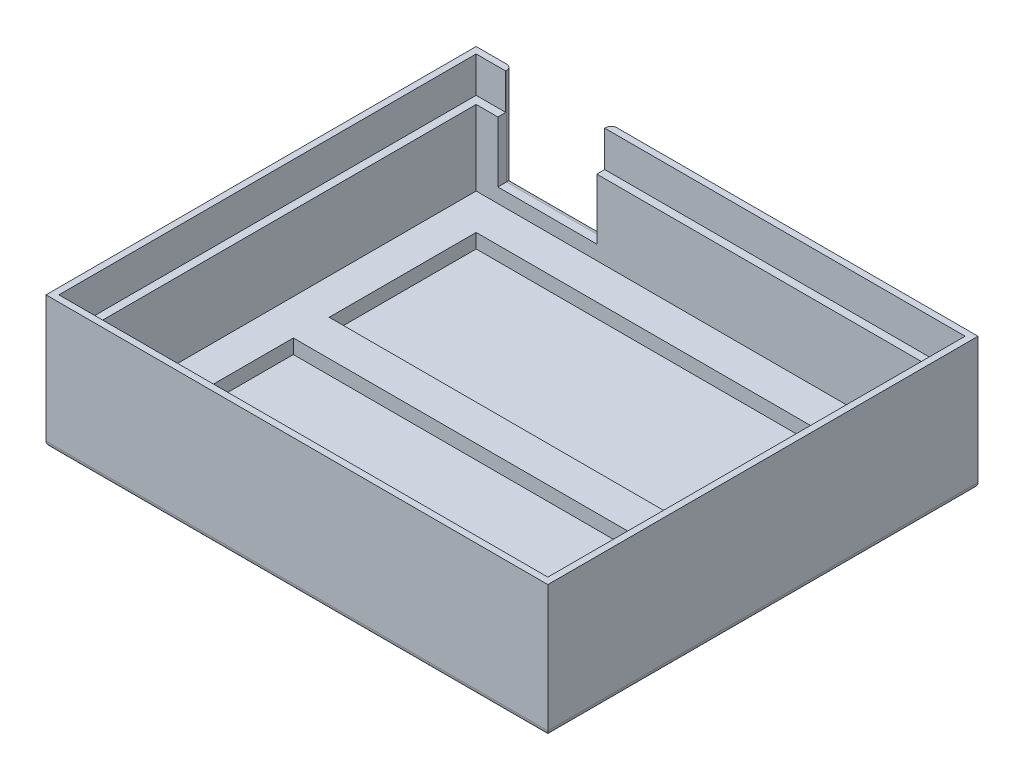
ISO-10303-21;
HEADER;
FILE_DESCRIPTION(('STEP AP214'),'2;1');
FILE_NAME('part.step','',(''),(''),'','','');
FILE_SCHEMA(('AUTOMOTIVE_DESIGN { 1 0 10303 214 1 1 1 1 }'));
ENDSEC;
DATA;
#1=APPLICATION_CONTEXT('core data for automotive mechanical design processes');
#2=APPLICATION_PROTOCOL_DEFINITION('international standard','automotive_design',2000,#1);
#3=PRODUCT_CONTEXT('',#1,'mechanical');
#4=PRODUCT('Part','Part','',(#3));
#5=PRODUCT_RELATED_PRODUCT_CATEGORY('part','',(#4));
#6=PRODUCT_DEFINITION_FORMATION('','',#4);
#7=PRODUCT_DEFINITION_CONTEXT('part definition',#1,'design');
#8=PRODUCT_DEFINITION('design','',#6,#7);
#9=PRODUCT_DEFINITION_SHAPE('','',#8);
#10=(LENGTH_UNIT() NAMED_UNIT(*) SI_UNIT(.MILLI.,.METRE.));
#11=(NAMED_UNIT(*) PLANE_ANGLE_UNIT() SI_UNIT($,.RADIAN.));
#12=(NAMED_UNIT(*) SI_UNIT($,.STERADIAN.) SOLID_ANGLE_UNIT());
#13=UNCERTAINTY_MEASURE_WITH_UNIT(LENGTH_MEASURE(1.E-05),#10,'distance_accuracy_value','');
#14=(GEOMETRIC_REPRESENTATION_CONTEXT(3) GLOBAL_UNCERTAINTY_ASSIGNED_CONTEXT((#13)) GLOBAL_UNIT_ASSIGNED_CONTEXT((#10,
#11,#12)) REPRESENTATION_CONTEXT('',''));
#15=CARTESIAN_POINT('',(0.,0.,0.));
#16=DIRECTION('',(0.,0.,1.));
#17=DIRECTION('',(1.,0.,0.));
#18=AXIS2_PLACEMENT_3D('',#15,#16,#17);
#19=CARTESIAN_POINT('',(45.4436090225564,18.46,-13.5545112781955));
#20=DIRECTION('',(0.,0.,1.));
#21=DIRECTION('',(1.,0.,0.));
#22=AXIS2_PLACEMENT_3D('',#19,#20,#21);
#23=PLANE('',#22);
#24=DIRECTION('',(0.,-1.,0.));
#25=VECTOR('',#24,1.);
#26=CARTESIAN_POINT('',(45.4436090225564,18.46,-13.5545112781955));
#27=LINE('',#26,#25);
#28=CARTESIAN_POINT('',(45.4436090225564,13.46,-13.5545112781955));
#29=VERTEX_POINT('',#28);
#30=CARTESIAN_POINT('',(45.4436090225564,3.,-13.5545112781955));
#31=VERTEX_POINT('',#30);
#32=EDGE_CURVE('E324',#29,#31,#27,.T.);
#33=ORIENTED_EDGE('',*,*,#32,.F.);
#34=DIRECTION('',(-1.,0.,0.));
#35=VECTOR('',#34,1.);
#36=CARTESIAN_POINT('',(45.4436090225564,13.46,-13.5545112781955));
#37=LINE('',#36,#35);
#38=CARTESIAN_POINT('',(-3.72239362558462,13.46,-13.5545112781955));
#39=VERTEX_POINT('',#38);
#40=EDGE_CURVE('E305',#29,#39,#37,.T.);
#41=ORIENTED_EDGE('',*,*,#40,.T.);
#42=DIRECTION('',(0.,1.,0.));
#43=VECTOR('',#42,1.);
#44=CARTESIAN_POINT('',(-3.72239362558462,18.46,-13.5545112781955));
#45=LINE('',#44,#43);
#46=CARTESIAN_POINT('',(-3.72239362558462,5.0059768774848,-13.5545112781955));
#47=VERTEX_POINT('',#46);
#48=EDGE_CURVE('E501',#47,#39,#45,.T.);
#49=ORIENTED_EDGE('',*,*,#48,.F.);
#50=DIRECTION('',(1.,0.,0.));
#51=VECTOR('',#50,1.);
#52=CARTESIAN_POINT('',(45.4436090225564,5.0059768774848,-13.5545112781955));
#53=LINE('',#52,#51);
#54=CARTESIAN_POINT('',(-17.5303936255836,5.0059768774848,-13.5545112781955));
#55=VERTEX_POINT('',#54);
#56=EDGE_CURVE('E550',#55,#47,#53,.T.);
#57=ORIENTED_EDGE('',*,*,#56,.F.);
#58=DIRECTION('',(0.,-1.,0.));
#59=VECTOR('',#58,1.);
#60=CARTESIAN_POINT('',(-17.5303936255836,18.46,-13.5545112781955));
#61=LINE('',#60,#59);
#62=CARTESIAN_POINT('',(-17.5303936255836,13.46,-13.5545112781955));
#63=VERTEX_POINT('',#62);
#64=EDGE_CURVE('E562',#63,#55,#61,.T.);
#65=ORIENTED_EDGE('',*,*,#64,.F.);
#66=CARTESIAN_POINT('',(-20.5563909774436,13.46,-13.5545112781955));
#67=VERTEX_POINT('',#66);
#68=EDGE_CURVE('E318',#63,#67,#37,.T.);
#69=ORIENTED_EDGE('',*,*,#68,.T.);
#70=DIRECTION('',(0.,-1.,0.));
#71=VECTOR('',#70,1.);
#72=CARTESIAN_POINT('',(-20.5563909774436,18.46,-13.5545112781955));
#73=LINE('',#72,#71);
#74=CARTESIAN_POINT('',(-20.5563909774436,3.,-13.5545112781955));
#75=VERTEX_POINT('',#74);
#76=EDGE_CURVE('E368',#67,#75,#73,.T.);
#77=ORIENTED_EDGE('',*,*,#76,.T.);
#78=DIRECTION('',(-1.,0.,0.));
#79=VECTOR('',#78,1.);
#80=CARTESIAN_POINT('',(-20.5563909774436,3.,-13.5545112781955));
#81=LINE('',#80,#79);
#82=EDGE_CURVE('E333',#31,#75,#81,.T.);
#83=ORIENTED_EDGE('',*,*,#82,.F.);
#84=EDGE_LOOP('',(#33,#41,#49,#57,#65,#69,#77,#83));
#85=FACE_BOUND('',#84,.T.);
#86=ADVANCED_FACE('F45',(#85),#23,.T.);
#87=CARTESIAN_POINT('',(-20.5563909774436,18.46,-13.5545112781955));
#88=DIRECTION('',(1.,0.,0.));
#89=DIRECTION('',(0.,0.,-1.));
#90=AXIS2_PLACEMENT_3D('',#87,#88,#89);
#91=PLANE('',#90);
#92=ORIENTED_EDGE('',*,*,#76,.F.);
#93=DIRECTION('',(0.,0.,1.));
#94=VECTOR('',#93,1.);
#95=CARTESIAN_POINT('',(-20.5563909774436,13.46,42.4454887218045));
#96=LINE('',#95,#94);
#97=CARTESIAN_POINT('',(-20.5563909774436,13.46,42.4454887218045));
#98=VERTEX_POINT('',#97);
#99=EDGE_CURVE('E317',#67,#98,#96,.T.);
#100=ORIENTED_EDGE('',*,*,#99,.T.);
#101=DIRECTION('',(0.,-1.,0.));
#102=VECTOR('',#101,1.);
#103=CARTESIAN_POINT('',(-20.5563909774436,18.46,42.4454887218045));
#104=LINE('',#103,#102);
#105=CARTESIAN_POINT('',(-20.5563909774436,3.,42.4454887218045));
#106=VERTEX_POINT('',#105);
#107=EDGE_CURVE('E342',#98,#106,#104,.T.);
#108=ORIENTED_EDGE('',*,*,#107,.T.);
#109=DIRECTION('',(0.,0.,1.));
#110=VECTOR('',#109,1.);
#111=CARTESIAN_POINT('',(-20.5563909774436,3.,-13.5545112781955));
#112=LINE('',#111,#110);
#113=EDGE_CURVE('E335',#75,#106,#112,.T.);
#114=ORIENTED_EDGE('',*,*,#113,.F.);
#115=EDGE_LOOP('',(#92,#100,#108,#114));
#116=FACE_BOUND('',#115,.T.);
#117=ADVANCED_FACE('F801',(#116),#91,.T.);
#118=CARTESIAN_POINT('',(-20.5563909774436,18.46,42.4454887218045));
#119=DIRECTION('',(0.,0.,-1.));
#120=DIRECTION('',(-1.,0.,0.));
#121=AXIS2_PLACEMENT_3D('',#118,#119,#120);
#122=PLANE('',#121);
#123=ORIENTED_EDGE('',*,*,#107,.F.);
#124=DIRECTION('',(1.,0.,0.));
#125=VECTOR('',#124,1.);
#126=CARTESIAN_POINT('',(45.4436090225564,13.46,42.4454887218045));
#127=LINE('',#126,#125);
#128=CARTESIAN_POINT('',(45.4436090225564,13.46,42.4454887218045));
#129=VERTEX_POINT('',#128);
#130=EDGE_CURVE('E381',#98,#129,#127,.T.);
#131=ORIENTED_EDGE('',*,*,#130,.T.);
#132=DIRECTION('',(0.,-1.,0.));
#133=VECTOR('',#132,1.);
#134=CARTESIAN_POINT('',(45.4436090225564,18.46,42.4454887218045));
#135=LINE('',#134,#133);
#136=CARTESIAN_POINT('',(45.4436090225564,3.,42.4454887218045));
#137=VERTEX_POINT('',#136);
#138=EDGE_CURVE('E327',#129,#137,#135,.T.);
#139=ORIENTED_EDGE('',*,*,#138,.T.);
#140=DIRECTION('',(1.,0.,0.));
#141=VECTOR('',#140,1.);
#142=CARTESIAN_POINT('',(-20.5563909774436,3.,42.4454887218045));
#143=LINE('',#142,#141);
#144=EDGE_CURVE('E339',#106,#137,#143,.T.);
#145=ORIENTED_EDGE('',*,*,#144,.F.);
#146=EDGE_LOOP('',(#123,#131,#139,#145));
#147=FACE_BOUND('',#146,.T.);
#148=ADVANCED_FACE('F806',(#147),#122,.T.);
#149=CARTESIAN_POINT('',(45.4436090225564,18.46,42.4454887218045));
#150=DIRECTION('',(-1.,0.,0.));
#151=DIRECTION('',(0.,0.,1.));
#152=AXIS2_PLACEMENT_3D('',#149,#150,#151);
#153=PLANE('',#152);
#154=ORIENTED_EDGE('',*,*,#138,.F.);
#155=DIRECTION('',(0.,0.,-1.));
#156=VECTOR('',#155,1.);
#157=CARTESIAN_POINT('',(45.4436090225564,13.46,42.4454887218045));
#158=LINE('',#157,#156);
#159=EDGE_CURVE('E308',#129,#29,#158,.T.);
#160=ORIENTED_EDGE('',*,*,#159,.T.);
#161=ORIENTED_EDGE('',*,*,#32,.T.);
#162=DIRECTION('',(0.,0.,-1.));
#163=VECTOR('',#162,1.);
#164=CARTESIAN_POINT('',(45.4436090225564,3.,-13.5545112781955));
#165=LINE('',#164,#163);
#166=CARTESIAN_POINT('',(45.4436090225564,3.,16.9454887218045));
#167=VERTEX_POINT('',#166);
#168=EDGE_CURVE('E741',#167,#31,#165,.T.);
#169=ORIENTED_EDGE('',*,*,#168,.F.);
#170=DIRECTION('',(0.,1.,0.));
#171=VECTOR('',#170,1.);
#172=CARTESIAN_POINT('',(45.4436090225564,1.,16.9454887218045));
#173=LINE('',#172,#171);
#174=CARTESIAN_POINT('',(45.4436090225564,1.,16.9454887218045));
#175=VERTEX_POINT('',#174);
#176=EDGE_CURVE('E757',#175,#167,#173,.T.);
#177=ORIENTED_EDGE('',*,*,#176,.F.);
#178=DIRECTION('',(0.,0.,-1.));
#179=VECTOR('',#178,1.);
#180=CARTESIAN_POINT('',(45.4436090225564,1.,16.9454887218045));
#181=LINE('',#180,#179);
#182=CARTESIAN_POINT('',(45.4436090225564,1.,37.4454887218045));
#183=VERTEX_POINT('',#182);
#184=EDGE_CURVE('E763',#183,#175,#181,.T.);
#185=ORIENTED_EDGE('',*,*,#184,.F.);
#186=DIRECTION('',(0.,1.,0.));
#187=VECTOR('',#186,1.);
#188=CARTESIAN_POINT('',(45.4436090225564,1.,37.4454887218045));
#189=LINE('',#188,#187);
#190=CARTESIAN_POINT('',(45.4436090225564,3.,37.4454887218045));
#191=VERTEX_POINT('',#190);
#192=EDGE_CURVE('E762',#183,#191,#189,.T.);
#193=ORIENTED_EDGE('',*,*,#192,.T.);
#194=EDGE_CURVE('E737',#137,#191,#165,.T.);
#195=ORIENTED_EDGE('',*,*,#194,.F.);
#196=EDGE_LOOP('',(#154,#160,#161,#169,#177,#185,#193,#195));
#197=FACE_BOUND('',#196,.T.);
#198=ADVANCED_FACE('F322',(#197),#153,.T.);
#199=CARTESIAN_POINT('',(-15.5563909774436,3.,-8.55451127819549));
#200=DIRECTION('',(1.,0.,0.));
#201=DIRECTION('',(0.,0.,-1.));
#202=AXIS2_PLACEMENT_3D('',#199,#200,#201);
#203=PLANE('',#202);
#204=DIRECTION('',(0.,0.,1.));
#205=VECTOR('',#204,1.);
#206=CARTESIAN_POINT('',(-15.5563909774436,1.,-8.55451127819549));
#207=LINE('',#206,#205);
#208=CARTESIAN_POINT('',(-15.5563909774436,1.,16.9454887218045));
#209=VERTEX_POINT('',#208);
#210=CARTESIAN_POINT('',(-15.5563909774436,1.,37.4454887218045));
#211=VERTEX_POINT('',#210);
#212=EDGE_CURVE('E664',#209,#211,#207,.T.);
#213=ORIENTED_EDGE('',*,*,#212,.F.);
#214=DIRECTION('',(0.,-1.,0.));
#215=VECTOR('',#214,1.);
#216=CARTESIAN_POINT('',(-15.5563909774436,3.,16.9454887218045));
#217=LINE('',#216,#215);
#218=CARTESIAN_POINT('',(-15.5563909774436,3.,16.9454887218045));
#219=VERTEX_POINT('',#218);
#220=EDGE_CURVE('E623',#219,#209,#217,.T.);
#221=ORIENTED_EDGE('',*,*,#220,.F.);
#222=DIRECTION('',(0.,0.,1.));
#223=VECTOR('',#222,1.);
#224=CARTESIAN_POINT('',(-15.5563909774436,3.,-8.55451127819549));
#225=LINE('',#224,#223);
#226=CARTESIAN_POINT('',(-15.5563909774436,3.,37.4454887218045));
#227=VERTEX_POINT('',#226);
#228=EDGE_CURVE('E735',#219,#227,#225,.T.);
#229=ORIENTED_EDGE('',*,*,#228,.T.);
#230=DIRECTION('',(0.,-1.,0.));
#231=VECTOR('',#230,1.);
#232=CARTESIAN_POINT('',(-15.5563909774436,3.,37.4454887218045));
#233=LINE('',#232,#231);
#234=EDGE_CURVE('E718',#227,#211,#233,.T.);
#235=ORIENTED_EDGE('',*,*,#234,.T.);
#236=EDGE_LOOP('',(#213,#221,#229,#235));
#237=FACE_BOUND('',#236,.T.);
#238=ADVANCED_FACE('F783',(#237),#203,.T.);
#239=CARTESIAN_POINT('',(-15.5563909774436,3.,-8.55451127819549));
#240=VERTEX_POINT('',#239);
#241=CARTESIAN_POINT('',(-15.5563909774436,3.,11.9454887218045));
#242=VERTEX_POINT('',#241);
#243=EDGE_CURVE('E719',#240,#242,#225,.T.);
#244=ORIENTED_EDGE('',*,*,#243,.T.);
#245=DIRECTION('',(0.,-1.,0.));
#246=VECTOR('',#245,1.);
#247=CARTESIAN_POINT('',(-15.5563909774436,3.,11.9454887218045));
#248=LINE('',#247,#246);
#249=CARTESIAN_POINT('',(-15.5563909774436,1.,11.9454887218045));
#250=VERTEX_POINT('',#249);
#251=EDGE_CURVE('E641',#242,#250,#248,.T.);
#252=ORIENTED_EDGE('',*,*,#251,.T.);
#253=CARTESIAN_POINT('',(-15.5563909774436,1.,-8.55451127819549));
#254=VERTEX_POINT('',#253);
#255=EDGE_CURVE('E658',#254,#250,#207,.T.);
#256=ORIENTED_EDGE('',*,*,#255,.F.);
#257=DIRECTION('',(0.,-1.,0.));
#258=VECTOR('',#257,1.);
#259=CARTESIAN_POINT('',(-15.5563909774436,3.,-8.55451127819549));
#260=LINE('',#259,#258);
#261=EDGE_CURVE('E728',#240,#254,#260,.T.);
#262=ORIENTED_EDGE('',*,*,#261,.F.);
#263=EDGE_LOOP('',(#244,#252,#256,#262));
#264=FACE_BOUND('',#263,.T.);
#265=ADVANCED_FACE('F776',(#264),#203,.T.);
#266=CARTESIAN_POINT('',(40.4436090225564,3.,-8.55451127819549));
#267=DIRECTION('',(-1.,0.,0.));
#268=DIRECTION('',(0.,0.,1.));
#269=AXIS2_PLACEMENT_3D('',#266,#267,#268);
#270=PLANE('',#269);
#271=DIRECTION('',(0.,0.,-1.));
#272=VECTOR('',#271,1.);
#273=CARTESIAN_POINT('',(40.4436090225564,1.,-8.55451127819549));
#274=LINE('',#273,#272);
#275=CARTESIAN_POINT('',(40.4436090225564,1.,11.9454887218045));
#276=VERTEX_POINT('',#275);
#277=CARTESIAN_POINT('',(40.4436090225564,1.,-8.55451127819549));
#278=VERTEX_POINT('',#277);
#279=EDGE_CURVE('E695',#276,#278,#274,.T.);
#280=ORIENTED_EDGE('',*,*,#279,.F.);
#281=DIRECTION('',(0.,-1.,0.));
#282=VECTOR('',#281,1.);
#283=CARTESIAN_POINT('',(40.4436090225564,3.,11.9454887218045));
#284=LINE('',#283,#282);
#285=CARTESIAN_POINT('',(40.4436090225564,3.,11.9454887218045));
#286=VERTEX_POINT('',#285);
#287=EDGE_CURVE('E646',#286,#276,#284,.T.);
#288=ORIENTED_EDGE('',*,*,#287,.F.);
#289=DIRECTION('',(0.,0.,-1.));
#290=VECTOR('',#289,1.);
#291=CARTESIAN_POINT('',(40.4436090225564,3.,-8.55451127819549));
#292=LINE('',#291,#290);
#293=CARTESIAN_POINT('',(40.4436090225564,3.,-8.55451127819549));
#294=VERTEX_POINT('',#293);
#295=EDGE_CURVE('E711',#286,#294,#292,.T.);
#296=ORIENTED_EDGE('',*,*,#295,.T.);
#297=DIRECTION('',(0.,-1.,0.));
#298=VECTOR('',#297,1.);
#299=CARTESIAN_POINT('',(40.4436090225564,3.,-8.55451127819549));
#300=LINE('',#299,#298);
#301=EDGE_CURVE('E701',#294,#278,#300,.T.);
#302=ORIENTED_EDGE('',*,*,#301,.T.);
#303=EDGE_LOOP('',(#280,#288,#296,#302));
#304=FACE_BOUND('',#303,.T.);
#305=ADVANCED_FACE('F699',(#304),#270,.T.);
#306=CARTESIAN_POINT('',(0.,1.,0.));
#307=DIRECTION('',(0.,1.,0.));
#308=DIRECTION('',(0.,0.,1.));
#309=AXIS2_PLACEMENT_3D('',#306,#307,#308);
#310=PLANE('',#309);
#311=DIRECTION('',(1.,0.,0.));
#312=VECTOR('',#311,1.);
#313=CARTESIAN_POINT('',(-15.5563909774436,1.,37.4454887218045));
#314=LINE('',#313,#312);
#315=EDGE_CURVE('E663',#211,#183,#314,.T.);
#316=ORIENTED_EDGE('',*,*,#315,.T.);
#317=ORIENTED_EDGE('',*,*,#184,.T.);
#318=DIRECTION('',(1.,0.,0.));
#319=VECTOR('',#318,1.);
#320=CARTESIAN_POINT('',(-15.5563909774436,1.,16.9454887218045));
#321=LINE('',#320,#319);
#322=EDGE_CURVE('E638',#209,#175,#321,.T.);
#323=ORIENTED_EDGE('',*,*,#322,.F.);
#324=ORIENTED_EDGE('',*,*,#212,.T.);
#325=EDGE_LOOP('',(#316,#317,#323,#324));
#326=FACE_BOUND('',#325,.T.);
#327=ADVANCED_FACE('F941',(#326),#310,.T.);
#328=ORIENTED_EDGE('',*,*,#255,.T.);
#329=DIRECTION('',(-1.,0.,0.));
#330=VECTOR('',#329,1.);
#331=CARTESIAN_POINT('',(-15.5563909774436,1.,11.9454887218045));
#332=LINE('',#331,#330);
#333=EDGE_CURVE('E633',#276,#250,#332,.T.);
#334=ORIENTED_EDGE('',*,*,#333,.F.);
#335=ORIENTED_EDGE('',*,*,#279,.T.);
#336=DIRECTION('',(-1.,0.,0.));
#337=VECTOR('',#336,1.);
#338=CARTESIAN_POINT('',(-15.5563909774436,1.,-8.55451127819549));
#339=LINE('',#338,#337);
#340=EDGE_CURVE('E667',#278,#254,#339,.T.);
#341=ORIENTED_EDGE('',*,*,#340,.T.);
#342=EDGE_LOOP('',(#328,#334,#335,#341));
#343=FACE_BOUND('',#342,.T.);
#344=ADVANCED_FACE('F694',(#343),#310,.T.);
#345=CARTESIAN_POINT('',(-22.5563909774436,1.,-15.5545112781955));
#346=DIRECTION('',(1.,0.,0.));
#347=DIRECTION('',(0.,0.,-1.));
#348=AXIS2_PLACEMENT_3D('',#345,#346,#347);
#349=PLANE('',#348);
#350=DIRECTION('',(0.,-1.,0.));
#351=VECTOR('',#350,1.);
#352=CARTESIAN_POINT('',(-22.5563909774436,1.,-15.5545112781955));
#353=LINE('',#352,#351);
#354=CARTESIAN_POINT('',(-22.5563909774436,18.46,-15.5545112781955));
#355=VERTEX_POINT('',#354);
#356=CARTESIAN_POINT('',(-22.5563909774436,0.8,-15.5545112781955));
#357=VERTEX_POINT('',#356);
#358=EDGE_CURVE('E574',#355,#357,#353,.T.);
#359=ORIENTED_EDGE('',*,*,#358,.T.);
#360=DIRECTION('',(0.,0.,1.));
#361=VECTOR('',#360,1.);
#362=CARTESIAN_POINT('',(-22.5563909774436,0.8,-15.5545112781955));
#363=LINE('',#362,#361);
#364=CARTESIAN_POINT('',(-22.5563909774436,0.8,44.4454887218045));
#365=VERTEX_POINT('',#364);
#366=EDGE_CURVE('E528',#357,#365,#363,.T.);
#367=ORIENTED_EDGE('',*,*,#366,.T.);
#368=DIRECTION('',(0.,-1.,0.));
#369=VECTOR('',#368,1.);
#370=CARTESIAN_POINT('',(-22.5563909774436,1.,44.4454887218045));
#371=LINE('',#370,#369);
#372=CARTESIAN_POINT('',(-22.5563909774436,18.46,44.4454887218045));
#373=VERTEX_POINT('',#372);
#374=EDGE_CURVE('E568',#373,#365,#371,.T.);
#375=ORIENTED_EDGE('',*,*,#374,.F.);
#376=DIRECTION('',(0.,0.,1.));
#377=VECTOR('',#376,1.);
#378=CARTESIAN_POINT('',(-22.5563909774436,18.46,-15.5545112781955));
#379=LINE('',#378,#377);
#380=EDGE_CURVE('E373',#355,#373,#379,.T.);
#381=ORIENTED_EDGE('',*,*,#380,.F.);
#382=EDGE_LOOP('',(#359,#367,#375,#381));
#383=FACE_BOUND('',#382,.T.);
#384=ADVANCED_FACE('F925',(#383),#349,.F.);
#385=CARTESIAN_POINT('',(-22.5563909774436,1.,44.4454887218045));
#386=DIRECTION('',(0.,0.,-1.));
#387=DIRECTION('',(-1.,0.,0.));
#388=AXIS2_PLACEMENT_3D('',#385,#386,#387);
#389=PLANE('',#388);
#390=ORIENTED_EDGE('',*,*,#374,.T.);
#391=DIRECTION('',(1.,0.,0.));
#392=VECTOR('',#391,1.);
#393=CARTESIAN_POINT('',(-22.5563909774436,0.8,44.4454887218045));
#394=LINE('',#393,#392);
#395=CARTESIAN_POINT('',(47.4436090225564,0.8,44.4454887218045));
#396=VERTEX_POINT('',#395);
#397=EDGE_CURVE('E498',#365,#396,#394,.T.);
#398=ORIENTED_EDGE('',*,*,#397,.T.);
#399=DIRECTION('',(0.,-1.,0.));
#400=VECTOR('',#399,1.);
#401=CARTESIAN_POINT('',(47.4436090225564,1.,44.4454887218045));
#402=LINE('',#401,#400);
#403=CARTESIAN_POINT('',(47.4436090225564,18.46,44.4454887218045));
#404=VERTEX_POINT('',#403);
#405=EDGE_CURVE('E573',#404,#396,#402,.T.);
#406=ORIENTED_EDGE('',*,*,#405,.F.);
#407=DIRECTION('',(1.,0.,0.));
#408=VECTOR('',#407,1.);
#409=CARTESIAN_POINT('',(-22.5563909774436,18.46,44.4454887218045));
#410=LINE('',#409,#408);
#411=EDGE_CURVE('E888',#373,#404,#410,.T.);
#412=ORIENTED_EDGE('',*,*,#411,.F.);
#413=EDGE_LOOP('',(#390,#398,#406,#412));
#414=FACE_BOUND('',#413,.T.);
#415=ADVANCED_FACE('F927',(#414),#389,.F.);
#416=CARTESIAN_POINT('',(47.4436090225564,1.,-15.5545112781955));
#417=DIRECTION('',(-1.,0.,0.));
#418=DIRECTION('',(0.,0.,1.));
#419=AXIS2_PLACEMENT_3D('',#416,#417,#418);
#420=PLANE('',#419);
#421=ORIENTED_EDGE('',*,*,#405,.T.);
#422=DIRECTION('',(0.,0.,-1.));
#423=VECTOR('',#422,1.);
#424=CARTESIAN_POINT('',(47.4436090225564,0.8,-15.5545112781955));
#425=LINE('',#424,#423);
#426=CARTESIAN_POINT('',(47.4436090225564,0.8,-15.5545112781955));
#427=VERTEX_POINT('',#426);
#428=EDGE_CURVE('E601',#396,#427,#425,.T.);
#429=ORIENTED_EDGE('',*,*,#428,.T.);
#430=DIRECTION('',(0.,-1.,0.));
#431=VECTOR('',#430,1.);
#432=CARTESIAN_POINT('',(47.4436090225564,1.,-15.5545112781955));
#433=LINE('',#432,#431);
#434=CARTESIAN_POINT('',(47.4436090225564,18.46,-15.5545112781955));
#435=VERTEX_POINT('',#434);
#436=EDGE_CURVE('E613',#435,#427,#433,.T.);
#437=ORIENTED_EDGE('',*,*,#436,.F.);
#438=DIRECTION('',(0.,0.,-1.));
#439=VECTOR('',#438,1.);
#440=CARTESIAN_POINT('',(47.4436090225564,18.46,-15.5545112781955));
#441=LINE('',#440,#439);
#442=EDGE_CURVE('E891',#404,#435,#441,.T.);
#443=ORIENTED_EDGE('',*,*,#442,.F.);
#444=EDGE_LOOP('',(#421,#429,#437,#443));
#445=FACE_BOUND('',#444,.T.);
#446=ADVANCED_FACE('F822',(#445),#420,.F.);
#447=CARTESIAN_POINT('',(-22.5563909774436,1.,-15.5545112781955));
#448=DIRECTION('',(0.,0.,1.));
#449=DIRECTION('',(1.,0.,0.));
#450=AXIS2_PLACEMENT_3D('',#447,#448,#449);
#451=PLANE('',#450);
#452=DIRECTION('',(-1.,0.,0.));
#453=VECTOR('',#452,1.);
#454=CARTESIAN_POINT('',(-22.5563909774436,18.46,-15.5545112781955));
#455=LINE('',#454,#453);
#456=CARTESIAN_POINT('',(-18.3303936255836,18.46,-15.5545112781955));
#457=VERTEX_POINT('',#456);
#458=EDGE_CURVE('E618',#457,#355,#455,.T.);
#459=ORIENTED_EDGE('',*,*,#458,.F.);
#460=DIRECTION('',(0.,1.,0.));
#461=VECTOR('',#460,1.);
#462=CARTESIAN_POINT('',(-18.3303936255836,1.,-15.5545112781955));
#463=LINE('',#462,#461);
#464=CARTESIAN_POINT('',(-18.3303936255836,4.2059768774848,-15.5545112781955));
#465=VERTEX_POINT('',#464);
#466=EDGE_CURVE('E879',#457,#465,#463,.F.);
#467=ORIENTED_EDGE('',*,*,#466,.T.);
#468=DIRECTION('',(-1.,0.,0.));
#469=VECTOR('',#468,1.);
#470=CARTESIAN_POINT('',(-22.5563909774436,4.2059768774848,-15.5545112781955));
#471=LINE('',#470,#469);
#472=CARTESIAN_POINT('',(-2.92239362558461,4.2059768774848,-15.5545112781955));
#473=VERTEX_POINT('',#472);
#474=EDGE_CURVE('E78',#465,#473,#471,.F.);
#475=ORIENTED_EDGE('',*,*,#474,.T.);
#476=DIRECTION('',(0.,-1.,0.));
#477=VECTOR('',#476,1.);
#478=CARTESIAN_POINT('',(-2.92239362558461,1.00000000000001,-15.5545112781955));
#479=LINE('',#478,#477);
#480=CARTESIAN_POINT('',(-2.92239362558462,18.46,-15.5545112781955));
#481=VERTEX_POINT('',#480);
#482=EDGE_CURVE('E881',#473,#481,#479,.F.);
#483=ORIENTED_EDGE('',*,*,#482,.T.);
#484=EDGE_CURVE('E372',#435,#481,#455,.T.);
#485=ORIENTED_EDGE('',*,*,#484,.F.);
#486=ORIENTED_EDGE('',*,*,#436,.T.);
#487=DIRECTION('',(-1.,0.,0.));
#488=VECTOR('',#487,1.);
#489=CARTESIAN_POINT('',(-22.5563909774436,0.8,-15.5545112781955));
#490=LINE('',#489,#488);
#491=EDGE_CURVE('E605',#427,#357,#490,.T.);
#492=ORIENTED_EDGE('',*,*,#491,.T.);
#493=ORIENTED_EDGE('',*,*,#358,.F.);
#494=EDGE_LOOP('',(#459,#467,#475,#483,#485,#486,#492,#493));
#495=FACE_BOUND('',#494,.T.);
#496=ADVANCED_FACE('F817',(#495),#451,.F.);
#497=CARTESIAN_POINT('',(0.,0.,0.));
#498=DIRECTION('',(0.,1.,0.));
#499=DIRECTION('',(0.,0.,1.));
#500=AXIS2_PLACEMENT_3D('',#497,#498,#499);
#501=PLANE('',#500);
#502=DIRECTION('',(0.,0.,-1.));
#503=VECTOR('',#502,1.);
#504=CARTESIAN_POINT('',(46.6436090225564,0.,0.));
#505=LINE('',#504,#503);
#506=CARTESIAN_POINT('',(46.6436090225564,0.,-14.7545112781955));
#507=VERTEX_POINT('',#506);
#508=CARTESIAN_POINT('',(46.6436090225564,0.,43.6454887218045));
#509=VERTEX_POINT('',#508);
#510=EDGE_CURVE('E594',#507,#509,#505,.F.);
#511=ORIENTED_EDGE('',*,*,#510,.T.);
#512=DIRECTION('',(1.,0.,0.));
#513=VECTOR('',#512,1.);
#514=CARTESIAN_POINT('',(0.,0.,43.6454887218045));
#515=LINE('',#514,#513);
#516=CARTESIAN_POINT('',(-21.7563909774436,0.,43.6454887218045));
#517=VERTEX_POINT('',#516);
#518=EDGE_CURVE('E597',#509,#517,#515,.F.);
#519=ORIENTED_EDGE('',*,*,#518,.T.);
#520=DIRECTION('',(0.,0.,1.));
#521=VECTOR('',#520,1.);
#522=CARTESIAN_POINT('',(-21.7563909774436,0.,0.));
#523=LINE('',#522,#521);
#524=CARTESIAN_POINT('',(-21.7563909774436,0.,-14.7545112781955));
#525=VERTEX_POINT('',#524);
#526=EDGE_CURVE('E588',#517,#525,#523,.F.);
#527=ORIENTED_EDGE('',*,*,#526,.T.);
#528=DIRECTION('',(-1.,0.,0.));
#529=VECTOR('',#528,1.);
#530=CARTESIAN_POINT('',(0.,0.,-14.7545112781955));
#531=LINE('',#530,#529);
#532=EDGE_CURVE('E591',#525,#507,#531,.F.);
#533=ORIENTED_EDGE('',*,*,#532,.T.);
#534=EDGE_LOOP('',(#511,#519,#527,#533));
#535=FACE_BOUND('',#534,.T.);
#536=ADVANCED_FACE('F796',(#535),#501,.F.);
#537=CARTESIAN_POINT('',(0.,18.46,0.));
#538=DIRECTION('',(0.,1.,0.));
#539=DIRECTION('',(0.,0.,1.));
#540=AXIS2_PLACEMENT_3D('',#537,#538,#539);
#541=PLANE('',#540);
#542=DIRECTION('',(0.,0.,1.));
#543=VECTOR('',#542,1.);
#544=CARTESIAN_POINT('',(-17.5303936255836,18.46,0.));
#545=LINE('',#544,#543);
#546=CARTESIAN_POINT('',(-17.5303936255836,18.46,-14.7545112781955));
#547=VERTEX_POINT('',#546);
#548=CARTESIAN_POINT('',(-17.5303936255836,18.46,-14.6545112781955));
#549=VERTEX_POINT('',#548);
#550=EDGE_CURVE('E545',#547,#549,#545,.T.);
#551=ORIENTED_EDGE('',*,*,#550,.F.);
#552=CARTESIAN_POINT('',(-18.3303936255836,18.46,-14.7545112781955));
#553=DIRECTION('',(0.,1.,0.));
#554=DIRECTION('',(0.,0.,1.));
#555=AXIS2_PLACEMENT_3D('',#552,#553,#554);
#556=CIRCLE('',#555,0.8);
#557=EDGE_CURVE('E534',#547,#457,#556,.T.);
#558=ORIENTED_EDGE('',*,*,#557,.T.);
#559=ORIENTED_EDGE('',*,*,#458,.T.);
#560=ORIENTED_EDGE('',*,*,#380,.T.);
#561=ORIENTED_EDGE('',*,*,#411,.T.);
#562=ORIENTED_EDGE('',*,*,#442,.T.);
#563=ORIENTED_EDGE('',*,*,#484,.T.);
#564=CARTESIAN_POINT('',(-2.92239362558462,18.46,-14.7545112781955));
#565=DIRECTION('',(0.,1.,0.));
#566=DIRECTION('',(0.,0.,1.));
#567=AXIS2_PLACEMENT_3D('',#564,#565,#566);
#568=CIRCLE('',#567,0.8);
#569=CARTESIAN_POINT('',(-3.72239362558462,18.46,-14.7545112781955));
#570=VERTEX_POINT('',#569);
#571=EDGE_CURVE('E527',#481,#570,#568,.T.);
#572=ORIENTED_EDGE('',*,*,#571,.T.);
#573=DIRECTION('',(0.,0.,-1.));
#574=VECTOR('',#573,1.);
#575=CARTESIAN_POINT('',(-3.72239362558462,18.46,0.));
#576=LINE('',#575,#574);
#577=CARTESIAN_POINT('',(-3.72239362558462,18.46,-14.6545112781955));
#578=VERTEX_POINT('',#577);
#579=EDGE_CURVE('E504',#578,#570,#576,.T.);
#580=ORIENTED_EDGE('',*,*,#579,.F.);
#581=DIRECTION('',(-1.,0.,0.));
#582=VECTOR('',#581,1.);
#583=CARTESIAN_POINT('',(46.5436090225564,18.46,-14.6545112781955));
#584=LINE('',#583,#582);
#585=CARTESIAN_POINT('',(46.5436090225564,18.46,-14.6545112781955));
#586=VERTEX_POINT('',#585);
#587=EDGE_CURVE('E443',#586,#578,#584,.T.);
#588=ORIENTED_EDGE('',*,*,#587,.F.);
#589=DIRECTION('',(0.,0.,-1.));
#590=VECTOR('',#589,1.);
#591=CARTESIAN_POINT('',(46.5436090225564,18.46,43.5454887218045));
#592=LINE('',#591,#590);
#593=CARTESIAN_POINT('',(46.5436090225564,18.46,43.5454887218045));
#594=VERTEX_POINT('',#593);
#595=EDGE_CURVE('E385',#594,#586,#592,.T.);
#596=ORIENTED_EDGE('',*,*,#595,.F.);
#597=DIRECTION('',(1.,0.,0.));
#598=VECTOR('',#597,1.);
#599=CARTESIAN_POINT('',(46.5436090225564,18.46,43.5454887218045));
#600=LINE('',#599,#598);
#601=CARTESIAN_POINT('',(-21.6563909774436,18.46,43.5454887218045));
#602=VERTEX_POINT('',#601);
#603=EDGE_CURVE('E392',#602,#594,#600,.T.);
#604=ORIENTED_EDGE('',*,*,#603,.F.);
#605=DIRECTION('',(0.,0.,1.));
#606=VECTOR('',#605,1.);
#607=CARTESIAN_POINT('',(-21.6563909774436,18.46,43.5454887218045));
#608=LINE('',#607,#606);
#609=CARTESIAN_POINT('',(-21.6563909774436,18.46,-14.6545112781955));
#610=VERTEX_POINT('',#609);
#611=EDGE_CURVE('E452',#610,#602,#608,.T.);
#612=ORIENTED_EDGE('',*,*,#611,.F.);
#613=EDGE_CURVE('E442',#549,#610,#584,.T.);
#614=ORIENTED_EDGE('',*,*,#613,.F.);
#615=EDGE_LOOP('',(#551,#558,#559,#560,#561,#562,#563,#572,#580,#588,#596,#604,#612,#614));
#616=FACE_BOUND('',#615,.T.);
#617=ADVANCED_FACE('F482',(#616),#541,.T.);
#618=CARTESIAN_POINT('',(0.,3.,0.));
#619=DIRECTION('',(0.,1.,0.));
#620=DIRECTION('',(0.,0.,1.));
#621=AXIS2_PLACEMENT_3D('',#618,#619,#620);
#622=PLANE('',#621);
#623=DIRECTION('',(1.,0.,0.));
#624=VECTOR('',#623,1.);
#625=CARTESIAN_POINT('',(-15.5563909774436,3.,16.9454887218045));
#626=LINE('',#625,#624);
#627=EDGE_CURVE('E637',#219,#167,#626,.T.);
#628=ORIENTED_EDGE('',*,*,#627,.T.);
#629=ORIENTED_EDGE('',*,*,#168,.T.);
#630=ORIENTED_EDGE('',*,*,#82,.T.);
#631=ORIENTED_EDGE('',*,*,#113,.T.);
#632=ORIENTED_EDGE('',*,*,#144,.T.);
#633=ORIENTED_EDGE('',*,*,#194,.T.);
#634=DIRECTION('',(1.,0.,0.));
#635=VECTOR('',#634,1.);
#636=CARTESIAN_POINT('',(-15.5563909774436,3.,37.4454887218045));
#637=LINE('',#636,#635);
#638=EDGE_CURVE('E715',#227,#191,#637,.T.);
#639=ORIENTED_EDGE('',*,*,#638,.F.);
#640=ORIENTED_EDGE('',*,*,#228,.F.);
#641=EDGE_LOOP('',(#628,#629,#630,#631,#632,#633,#639,#640));
#642=FACE_BOUND('',#641,.T.);
#643=ORIENTED_EDGE('',*,*,#243,.F.);
#644=DIRECTION('',(-1.,0.,0.));
#645=VECTOR('',#644,1.);
#646=CARTESIAN_POINT('',(-15.5563909774436,3.,-8.55451127819549));
#647=LINE('',#646,#645);
#648=EDGE_CURVE('E725',#294,#240,#647,.T.);
#649=ORIENTED_EDGE('',*,*,#648,.F.);
#650=ORIENTED_EDGE('',*,*,#295,.F.);
#651=DIRECTION('',(-1.,0.,0.));
#652=VECTOR('',#651,1.);
#653=CARTESIAN_POINT('',(-15.5563909774436,3.,11.9454887218045));
#654=LINE('',#653,#652);
#655=EDGE_CURVE('E647',#286,#242,#654,.T.);
#656=ORIENTED_EDGE('',*,*,#655,.T.);
#657=EDGE_LOOP('',(#643,#649,#650,#656));
#658=FACE_BOUND('',#657,.T.);
#659=ADVANCED_FACE('F773',(#642,#658),#622,.T.);
#660=CARTESIAN_POINT('',(-15.5563909774436,3.,-8.55451127819549));
#661=DIRECTION('',(0.,0.,1.));
#662=DIRECTION('',(1.,0.,0.));
#663=AXIS2_PLACEMENT_3D('',#660,#661,#662);
#664=PLANE('',#663);
#665=ORIENTED_EDGE('',*,*,#340,.F.);
#666=ORIENTED_EDGE('',*,*,#301,.F.);
#667=ORIENTED_EDGE('',*,*,#648,.T.);
#668=ORIENTED_EDGE('',*,*,#261,.T.);
#669=EDGE_LOOP('',(#665,#666,#667,#668));
#670=FACE_BOUND('',#669,.T.);
#671=ADVANCED_FACE('F789',(#670),#664,.T.);
#672=CARTESIAN_POINT('',(-15.5563909774436,3.,37.4454887218045));
#673=DIRECTION('',(0.,0.,-1.));
#674=DIRECTION('',(-1.,0.,0.));
#675=AXIS2_PLACEMENT_3D('',#672,#673,#674);
#676=PLANE('',#675);
#677=ORIENTED_EDGE('',*,*,#315,.F.);
#678=ORIENTED_EDGE('',*,*,#234,.F.);
#679=ORIENTED_EDGE('',*,*,#638,.T.);
#680=ORIENTED_EDGE('',*,*,#192,.F.);
#681=EDGE_LOOP('',(#677,#678,#679,#680));
#682=FACE_BOUND('',#681,.T.);
#683=ADVANCED_FACE('F786',(#682),#676,.T.);
#684=CARTESIAN_POINT('',(-17.5303936255836,18.464576877485,-5.55451127819549));
#685=DIRECTION('',(-1.,0.,0.));
#686=DIRECTION('',(0.,0.,1.));
#687=AXIS2_PLACEMENT_3D('',#684,#685,#686);
#688=PLANE('',#687);
#689=DIRECTION('',(0.,0.,-1.));
#690=VECTOR('',#689,1.);
#691=CARTESIAN_POINT('',(-17.5303936255836,5.0059768774848,-5.55451127819549));
#692=LINE('',#691,#690);
#693=CARTESIAN_POINT('',(-17.5303936255836,5.0059768774848,-14.7545112781955));
#694=VERTEX_POINT('',#693);
#695=EDGE_CURVE('E507',#55,#694,#692,.T.);
#696=ORIENTED_EDGE('',*,*,#695,.T.);
#697=DIRECTION('',(0.,1.,0.));
#698=VECTOR('',#697,1.);
#699=CARTESIAN_POINT('',(-17.5303936255836,18.464576877485,-14.7545112781955));
#700=LINE('',#699,#698);
#701=EDGE_CURVE('E521',#694,#547,#700,.T.);
#702=ORIENTED_EDGE('',*,*,#701,.T.);
#703=ORIENTED_EDGE('',*,*,#550,.T.);
#704=DIRECTION('',(0.,-1.,0.));
#705=VECTOR('',#704,1.);
#706=CARTESIAN_POINT('',(-17.5303936255836,18.464576877485,-14.6545112781955));
#707=LINE('',#706,#705);
#708=CARTESIAN_POINT('',(-17.5303936255836,13.46,-14.6545112781955));
#709=VERTEX_POINT('',#708);
#710=EDGE_CURVE('E478',#549,#709,#707,.T.);
#711=ORIENTED_EDGE('',*,*,#710,.T.);
#712=DIRECTION('',(0.,0.,-1.));
#713=VECTOR('',#712,1.);
#714=CARTESIAN_POINT('',(-17.5303936255836,13.46,-5.55451127819549));
#715=LINE('',#714,#713);
#716=EDGE_CURVE('E410',#63,#709,#715,.T.);
#717=ORIENTED_EDGE('',*,*,#716,.F.);
#718=ORIENTED_EDGE('',*,*,#64,.T.);
#719=EDGE_LOOP('',(#696,#702,#703,#711,#717,#718));
#720=FACE_BOUND('',#719,.T.);
#721=ADVANCED_FACE('F814',(#720),#688,.F.);
#722=CARTESIAN_POINT('',(-3.72239362558461,5.0059768774848,-5.55451127819549));
#723=DIRECTION('',(0.,-1.,0.));
#724=DIRECTION('',(0.,0.,-1.));
#725=AXIS2_PLACEMENT_3D('',#722,#723,#724);
#726=PLANE('',#725);
#727=DIRECTION('',(0.,0.,-1.));
#728=VECTOR('',#727,1.);
#729=CARTESIAN_POINT('',(-3.72239362558461,5.0059768774848,-5.55451127819549));
#730=LINE('',#729,#728);
#731=CARTESIAN_POINT('',(-3.72239362558461,5.0059768774848,-14.7545112781955));
#732=VERTEX_POINT('',#731);
#733=EDGE_CURVE('E544',#47,#732,#730,.T.);
#734=ORIENTED_EDGE('',*,*,#733,.T.);
#735=DIRECTION('',(-1.,0.,0.));
#736=VECTOR('',#735,1.);
#737=CARTESIAN_POINT('',(-3.72239362558461,5.0059768774848,-14.7545112781955));
#738=LINE('',#737,#736);
#739=EDGE_CURVE('E12',#732,#694,#738,.T.);
#740=ORIENTED_EDGE('',*,*,#739,.T.);
#741=ORIENTED_EDGE('',*,*,#695,.F.);
#742=ORIENTED_EDGE('',*,*,#56,.T.);
#743=EDGE_LOOP('',(#734,#740,#741,#742));
#744=FACE_BOUND('',#743,.T.);
#745=ADVANCED_FACE('F971',(#744),#726,.F.);
#746=CARTESIAN_POINT('',(-3.72239362558461,6.2059768774848,-5.55451127819549));
#747=DIRECTION('',(1.,0.,0.));
#748=DIRECTION('',(0.,1.,0.));
#749=AXIS2_PLACEMENT_3D('',#746,#747,#748);
#750=PLANE('',#749);
#751=ORIENTED_EDGE('',*,*,#579,.T.);
#752=DIRECTION('',(0.,-1.,0.));
#753=VECTOR('',#752,1.);
#754=CARTESIAN_POINT('',(-3.72239362558461,6.2059768774848,-14.7545112781955));
#755=LINE('',#754,#753);
#756=EDGE_CURVE('E57',#570,#732,#755,.T.);
#757=ORIENTED_EDGE('',*,*,#756,.T.);
#758=ORIENTED_EDGE('',*,*,#733,.F.);
#759=ORIENTED_EDGE('',*,*,#48,.T.);
#760=DIRECTION('',(0.,0.,1.));
#761=VECTOR('',#760,1.);
#762=CARTESIAN_POINT('',(-3.72239362558462,13.46,-5.55451127819549));
#763=LINE('',#762,#761);
#764=CARTESIAN_POINT('',(-3.72239362558462,13.46,-14.6545112781955));
#765=VERTEX_POINT('',#764);
#766=EDGE_CURVE('E311',#765,#39,#763,.T.);
#767=ORIENTED_EDGE('',*,*,#766,.F.);
#768=DIRECTION('',(0.,1.,0.));
#769=VECTOR('',#768,1.);
#770=CARTESIAN_POINT('',(-3.72239362558461,6.2059768774848,-14.6545112781955));
#771=LINE('',#770,#769);
#772=EDGE_CURVE('E494',#765,#578,#771,.T.);
#773=ORIENTED_EDGE('',*,*,#772,.T.);
#774=EDGE_LOOP('',(#751,#757,#758,#759,#767,#773));
#775=FACE_BOUND('',#774,.T.);
#776=ADVANCED_FACE('F500',(#775),#750,.F.);
#777=CARTESIAN_POINT('',(-15.5563909774436,3.,16.9454887218045));
#778=DIRECTION('',(0.,0.,-1.));
#779=DIRECTION('',(-1.,0.,0.));
#780=AXIS2_PLACEMENT_3D('',#777,#778,#779);
#781=PLANE('',#780);
#782=ORIENTED_EDGE('',*,*,#322,.T.);
#783=ORIENTED_EDGE('',*,*,#176,.T.);
#784=ORIENTED_EDGE('',*,*,#627,.F.);
#785=ORIENTED_EDGE('',*,*,#220,.T.);
#786=EDGE_LOOP('',(#782,#783,#784,#785));
#787=FACE_BOUND('',#786,.T.);
#788=ADVANCED_FACE('F970',(#787),#781,.F.);
#789=CARTESIAN_POINT('',(-15.5563909774436,3.,11.9454887218045));
#790=DIRECTION('',(0.,0.,1.));
#791=DIRECTION('',(1.,0.,0.));
#792=AXIS2_PLACEMENT_3D('',#789,#790,#791);
#793=PLANE('',#792);
#794=ORIENTED_EDGE('',*,*,#333,.T.);
#795=ORIENTED_EDGE('',*,*,#251,.F.);
#796=ORIENTED_EDGE('',*,*,#655,.F.);
#797=ORIENTED_EDGE('',*,*,#287,.T.);
#798=EDGE_LOOP('',(#794,#795,#796,#797));
#799=FACE_BOUND('',#798,.T.);
#800=ADVANCED_FACE('F688',(#799),#793,.F.);
#801=CARTESIAN_POINT('',(46.5436090225564,13.46,-14.6545112781955));
#802=DIRECTION('',(0.,0.,-1.));
#803=DIRECTION('',(-1.,0.,0.));
#804=AXIS2_PLACEMENT_3D('',#801,#802,#803);
#805=PLANE('',#804);
#806=ORIENTED_EDGE('',*,*,#613,.T.);
#807=DIRECTION('',(0.,1.,0.));
#808=VECTOR('',#807,1.);
#809=CARTESIAN_POINT('',(-21.6563909774436,13.46,-14.6545112781955));
#810=LINE('',#809,#808);
#811=CARTESIAN_POINT('',(-21.6563909774436,13.46,-14.6545112781955));
#812=VERTEX_POINT('',#811);
#813=EDGE_CURVE('E417',#812,#610,#810,.T.);
#814=ORIENTED_EDGE('',*,*,#813,.F.);
#815=DIRECTION('',(-1.,0.,0.));
#816=VECTOR('',#815,1.);
#817=CARTESIAN_POINT('',(46.5436090225564,13.46,-14.6545112781955));
#818=LINE('',#817,#816);
#819=EDGE_CURVE('E391',#709,#812,#818,.T.);
#820=ORIENTED_EDGE('',*,*,#819,.F.);
#821=ORIENTED_EDGE('',*,*,#710,.F.);
#822=EDGE_LOOP('',(#806,#814,#820,#821));
#823=FACE_BOUND('',#822,.T.);
#824=ADVANCED_FACE('F474',(#823),#805,.F.);
#825=CARTESIAN_POINT('',(46.5436090225564,13.46,-14.6545112781955));
#826=VERTEX_POINT('',#825);
#827=EDGE_CURVE('E393',#826,#765,#818,.T.);
#828=ORIENTED_EDGE('',*,*,#827,.F.);
#829=DIRECTION('',(0.,1.,0.));
#830=VECTOR('',#829,1.);
#831=CARTESIAN_POINT('',(46.5436090225564,13.46,-14.6545112781955));
#832=LINE('',#831,#830);
#833=EDGE_CURVE('E422',#826,#586,#832,.T.);
#834=ORIENTED_EDGE('',*,*,#833,.T.);
#835=ORIENTED_EDGE('',*,*,#587,.T.);
#836=ORIENTED_EDGE('',*,*,#772,.F.);
#837=EDGE_LOOP('',(#828,#834,#835,#836));
#838=FACE_BOUND('',#837,.T.);
#839=ADVANCED_FACE('F495',(#838),#805,.F.);
#840=CARTESIAN_POINT('',(0.,13.46,0.));
#841=DIRECTION('',(0.,1.,0.));
#842=DIRECTION('',(0.,0.,1.));
#843=AXIS2_PLACEMENT_3D('',#840,#841,#842);
#844=PLANE('',#843);
#845=ORIENTED_EDGE('',*,*,#716,.T.);
#846=ORIENTED_EDGE('',*,*,#819,.T.);
#847=DIRECTION('',(0.,0.,1.));
#848=VECTOR('',#847,1.);
#849=CARTESIAN_POINT('',(-21.6563909774436,13.46,43.5454887218045));
#850=LINE('',#849,#848);
#851=CARTESIAN_POINT('',(-21.6563909774436,13.46,43.5454887218045));
#852=VERTEX_POINT('',#851);
#853=EDGE_CURVE('E429',#812,#852,#850,.T.);
#854=ORIENTED_EDGE('',*,*,#853,.T.);
#855=DIRECTION('',(1.,0.,0.));
#856=VECTOR('',#855,1.);
#857=CARTESIAN_POINT('',(46.5436090225564,13.46,43.5454887218045));
#858=LINE('',#857,#856);
#859=CARTESIAN_POINT('',(46.5436090225564,13.46,43.5454887218045));
#860=VERTEX_POINT('',#859);
#861=EDGE_CURVE('E433',#852,#860,#858,.T.);
#862=ORIENTED_EDGE('',*,*,#861,.T.);
#863=DIRECTION('',(0.,0.,-1.));
#864=VECTOR('',#863,1.);
#865=CARTESIAN_POINT('',(46.5436090225564,13.46,43.5454887218045));
#866=LINE('',#865,#864);
#867=EDGE_CURVE('E386',#860,#826,#866,.T.);
#868=ORIENTED_EDGE('',*,*,#867,.T.);
#869=ORIENTED_EDGE('',*,*,#827,.T.);
#870=ORIENTED_EDGE('',*,*,#766,.T.);
#871=ORIENTED_EDGE('',*,*,#40,.F.);
#872=ORIENTED_EDGE('',*,*,#159,.F.);
#873=ORIENTED_EDGE('',*,*,#130,.F.);
#874=ORIENTED_EDGE('',*,*,#99,.F.);
#875=ORIENTED_EDGE('',*,*,#68,.F.);
#876=EDGE_LOOP('',(#845,#846,#854,#862,#868,#869,#870,#871,#872,#873,#874,#875));
#877=FACE_BOUND('',#876,.T.);
#878=ADVANCED_FACE('F307',(#877),#844,.T.);
#879=CARTESIAN_POINT('',(46.5436090225564,13.46,43.5454887218045));
#880=DIRECTION('',(1.,0.,0.));
#881=DIRECTION('',(0.,0.,-1.));
#882=AXIS2_PLACEMENT_3D('',#879,#880,#881);
#883=PLANE('',#882);
#884=ORIENTED_EDGE('',*,*,#595,.T.);
#885=ORIENTED_EDGE('',*,*,#833,.F.);
#886=ORIENTED_EDGE('',*,*,#867,.F.);
#887=DIRECTION('',(0.,1.,0.));
#888=VECTOR('',#887,1.);
#889=CARTESIAN_POINT('',(46.5436090225564,13.46,43.5454887218045));
#890=LINE('',#889,#888);
#891=EDGE_CURVE('E406',#860,#594,#890,.T.);
#892=ORIENTED_EDGE('',*,*,#891,.T.);
#893=EDGE_LOOP('',(#884,#885,#886,#892));
#894=FACE_BOUND('',#893,.T.);
#895=ADVANCED_FACE('F1084',(#894),#883,.F.);
#896=CARTESIAN_POINT('',(46.5436090225564,13.46,43.5454887218045));
#897=DIRECTION('',(0.,0.,1.));
#898=DIRECTION('',(1.,0.,0.));
#899=AXIS2_PLACEMENT_3D('',#896,#897,#898);
#900=PLANE('',#899);
#901=ORIENTED_EDGE('',*,*,#603,.T.);
#902=ORIENTED_EDGE('',*,*,#891,.F.);
#903=ORIENTED_EDGE('',*,*,#861,.F.);
#904=DIRECTION('',(0.,1.,0.));
#905=VECTOR('',#904,1.);
#906=CARTESIAN_POINT('',(-21.6563909774436,13.46,43.5454887218045));
#907=LINE('',#906,#905);
#908=EDGE_CURVE('E411',#852,#602,#907,.T.);
#909=ORIENTED_EDGE('',*,*,#908,.T.);
#910=EDGE_LOOP('',(#901,#902,#903,#909));
#911=FACE_BOUND('',#910,.T.);
#912=ADVANCED_FACE('F485',(#911),#900,.F.);
#913=CARTESIAN_POINT('',(-21.6563909774436,13.46,43.5454887218045));
#914=DIRECTION('',(-1.,0.,0.));
#915=DIRECTION('',(0.,0.,1.));
#916=AXIS2_PLACEMENT_3D('',#913,#914,#915);
#917=PLANE('',#916);
#918=ORIENTED_EDGE('',*,*,#611,.T.);
#919=ORIENTED_EDGE('',*,*,#908,.F.);
#920=ORIENTED_EDGE('',*,*,#853,.F.);
#921=ORIENTED_EDGE('',*,*,#813,.T.);
#922=EDGE_LOOP('',(#918,#919,#920,#921));
#923=FACE_BOUND('',#922,.T.);
#924=ADVANCED_FACE('F481',(#923),#917,.F.);
#925=CARTESIAN_POINT('',(-22.5563909774436,0.8,-14.7545112781955));
#926=DIRECTION('',(-1.,0.,0.));
#927=DIRECTION('',(0.,0.,1.));
#928=AXIS2_PLACEMENT_3D('',#925,#926,#927);
#929=CYLINDRICAL_SURFACE('',#928,0.8);
#930=CARTESIAN_POINT('',(46.6436090225564,0.8,-14.7545112781955));
#931=DIRECTION('',(-0.707106781186548,0.,-0.707106781186547));
#932=DIRECTION('',(-0.707106781186547,0.,0.707106781186548));
#933=AXIS2_PLACEMENT_3D('',#930,#931,#932);
#934=ELLIPSE('',#933,1.13137084989848,0.8);
#935=EDGE_CURVE('E911',#507,#427,#934,.F.);
#936=ORIENTED_EDGE('',*,*,#935,.F.);
#937=ORIENTED_EDGE('',*,*,#532,.F.);
#938=CARTESIAN_POINT('',(-21.7563909774436,0.8,-14.7545112781955));
#939=DIRECTION('',(-0.707106781186547,0.,0.707106781186548));
#940=DIRECTION('',(0.707106781186548,0.,0.707106781186547));
#941=AXIS2_PLACEMENT_3D('',#938,#939,#940);
#942=ELLIPSE('',#941,1.13137084989848,0.8);
#943=EDGE_CURVE('E329',#357,#525,#942,.T.);
#944=ORIENTED_EDGE('',*,*,#943,.F.);
#945=ORIENTED_EDGE('',*,*,#491,.F.);
#946=EDGE_LOOP('',(#936,#937,#944,#945));
#947=FACE_BOUND('',#946,.T.);
#948=ADVANCED_FACE('F838',(#947),#929,.T.);
#949=CARTESIAN_POINT('',(-21.7563909774436,0.8,-15.5545112781955));
#950=DIRECTION('',(0.,0.,1.));
#951=DIRECTION('',(1.,0.,0.));
#952=AXIS2_PLACEMENT_3D('',#949,#950,#951);
#953=CYLINDRICAL_SURFACE('',#952,0.8);
#954=ORIENTED_EDGE('',*,*,#943,.T.);
#955=ORIENTED_EDGE('',*,*,#526,.F.);
#956=CARTESIAN_POINT('',(-21.7563909774436,0.8,43.6454887218045));
#957=DIRECTION('',(0.707106781186548,0.,0.707106781186547));
#958=DIRECTION('',(-0.707106781186547,0.,0.707106781186548));
#959=AXIS2_PLACEMENT_3D('',#956,#957,#958);
#960=ELLIPSE('',#959,1.13137084989848,0.8);
#961=EDGE_CURVE('E866',#365,#517,#960,.T.);
#962=ORIENTED_EDGE('',*,*,#961,.F.);
#963=ORIENTED_EDGE('',*,*,#366,.F.);
#964=EDGE_LOOP('',(#954,#955,#962,#963));
#965=FACE_BOUND('',#964,.T.);
#966=ADVANCED_FACE('F834',(#965),#953,.T.);
#967=CARTESIAN_POINT('',(46.6436090225564,0.8,-15.5545112781955));
#968=DIRECTION('',(0.,0.,-1.));
#969=DIRECTION('',(-1.,0.,0.));
#970=AXIS2_PLACEMENT_3D('',#967,#968,#969);
#971=CYLINDRICAL_SURFACE('',#970,0.8);
#972=ORIENTED_EDGE('',*,*,#935,.T.);
#973=ORIENTED_EDGE('',*,*,#428,.F.);
#974=CARTESIAN_POINT('',(46.6436090225564,0.8,43.6454887218045));
#975=DIRECTION('',(0.707106781186547,0.,-0.707106781186548));
#976=DIRECTION('',(-0.707106781186548,0.,-0.707106781186547));
#977=AXIS2_PLACEMENT_3D('',#974,#975,#976);
#978=ELLIPSE('',#977,1.13137084989848,0.8);
#979=EDGE_CURVE('E861',#509,#396,#978,.F.);
#980=ORIENTED_EDGE('',*,*,#979,.F.);
#981=ORIENTED_EDGE('',*,*,#510,.F.);
#982=EDGE_LOOP('',(#972,#973,#980,#981));
#983=FACE_BOUND('',#982,.T.);
#984=ADVANCED_FACE('F829',(#983),#971,.T.);
#985=CARTESIAN_POINT('',(-22.5563909774436,0.8,43.6454887218045));
#986=DIRECTION('',(1.,0.,0.));
#987=DIRECTION('',(0.,0.,-1.));
#988=AXIS2_PLACEMENT_3D('',#985,#986,#987);
#989=CYLINDRICAL_SURFACE('',#988,0.8);
#990=ORIENTED_EDGE('',*,*,#961,.T.);
#991=ORIENTED_EDGE('',*,*,#518,.F.);
#992=ORIENTED_EDGE('',*,*,#979,.T.);
#993=ORIENTED_EDGE('',*,*,#397,.F.);
#994=EDGE_LOOP('',(#990,#991,#992,#993));
#995=FACE_BOUND('',#994,.T.);
#996=ADVANCED_FACE('F824',(#995),#989,.T.);
#997=CARTESIAN_POINT('',(-2.92239362558461,6.2059768774848,-14.7545112781955));
#998=DIRECTION('',(0.,-1.,0.));
#999=DIRECTION('',(1.,0.,0.));
#1000=AXIS2_PLACEMENT_3D('',#997,#998,#999);
#1001=CYLINDRICAL_SURFACE('',#1000,0.8);
#1002=ORIENTED_EDGE('',*,*,#571,.F.);
#1003=ORIENTED_EDGE('',*,*,#482,.F.);
#1004=CARTESIAN_POINT('',(-2.92239362558461,4.2059768774848,-14.7545112781955));
#1005=DIRECTION('',(-0.707106781186547,-0.707106781186548,0.));
#1006=DIRECTION('',(0.707106781186548,-0.707106781186547,0.));
#1007=AXIS2_PLACEMENT_3D('',#1004,#1005,#1006);
#1008=ELLIPSE('',#1007,1.13137084989848,0.8);
#1009=EDGE_CURVE('E50',#732,#473,#1008,.T.);
#1010=ORIENTED_EDGE('',*,*,#1009,.F.);
#1011=ORIENTED_EDGE('',*,*,#756,.F.);
#1012=EDGE_LOOP('',(#1002,#1003,#1010,#1011));
#1013=FACE_BOUND('',#1012,.T.);
#1014=ADVANCED_FACE('F48',(#1013),#1001,.T.);
#1015=CARTESIAN_POINT('',(-3.72239362558461,4.2059768774848,-14.7545112781955));
#1016=DIRECTION('',(-1.,0.,0.));
#1017=DIRECTION('',(0.,0.,1.));
#1018=AXIS2_PLACEMENT_3D('',#1015,#1016,#1017);
#1019=CYLINDRICAL_SURFACE('',#1018,0.8);
#1020=ORIENTED_EDGE('',*,*,#1009,.T.);
#1021=ORIENTED_EDGE('',*,*,#474,.F.);
#1022=CARTESIAN_POINT('',(-18.3303936255836,4.2059768774848,-14.7545112781955));
#1023=DIRECTION('',(-0.707106781186547,0.707106781186547,0.));
#1024=DIRECTION('',(0.707106781186547,0.707106781186547,0.));
#1025=AXIS2_PLACEMENT_3D('',#1022,#1023,#1024);
#1026=ELLIPSE('',#1025,1.13137084989848,0.8);
#1027=EDGE_CURVE('E862',#694,#465,#1026,.T.);
#1028=ORIENTED_EDGE('',*,*,#1027,.F.);
#1029=ORIENTED_EDGE('',*,*,#739,.F.);
#1030=EDGE_LOOP('',(#1020,#1021,#1028,#1029));
#1031=FACE_BOUND('',#1030,.T.);
#1032=ADVANCED_FACE('F848',(#1031),#1019,.T.);
#1033=CARTESIAN_POINT('',(-18.3303936255836,18.464576877485,-14.7545112781955));
#1034=DIRECTION('',(0.,1.,0.));
#1035=DIRECTION('',(0.,0.,1.));
#1036=AXIS2_PLACEMENT_3D('',#1033,#1034,#1035);
#1037=CYLINDRICAL_SURFACE('',#1036,0.8);
#1038=ORIENTED_EDGE('',*,*,#1027,.T.);
#1039=ORIENTED_EDGE('',*,*,#466,.F.);
#1040=ORIENTED_EDGE('',*,*,#557,.F.);
#1041=ORIENTED_EDGE('',*,*,#701,.F.);
#1042=EDGE_LOOP('',(#1038,#1039,#1040,#1041));
#1043=FACE_BOUND('',#1042,.T.);
#1044=ADVANCED_FACE('F846',(#1043),#1037,.T.);
#1045=CLOSED_SHELL('',(#86,#117,#148,#198,#238,#265,#305,#327,#344,#384,#415,#446,#496,#536,
#617,#659,#671,#683,#721,#745,#776,#788,#800,#824,#839,#878,#895,#912,#924,#948,#966,#984,#996,
#1014,#1032,#1044));
#1046=MANIFOLD_SOLID_BREP('B2',#1045);
#1047=ADVANCED_BREP_SHAPE_REPRESENTATION('',(#18,#1046),#14);
#1048=SHAPE_DEFINITION_REPRESENTATION(#9,#1047);
ENDSEC;
END-ISO-10303-21;
